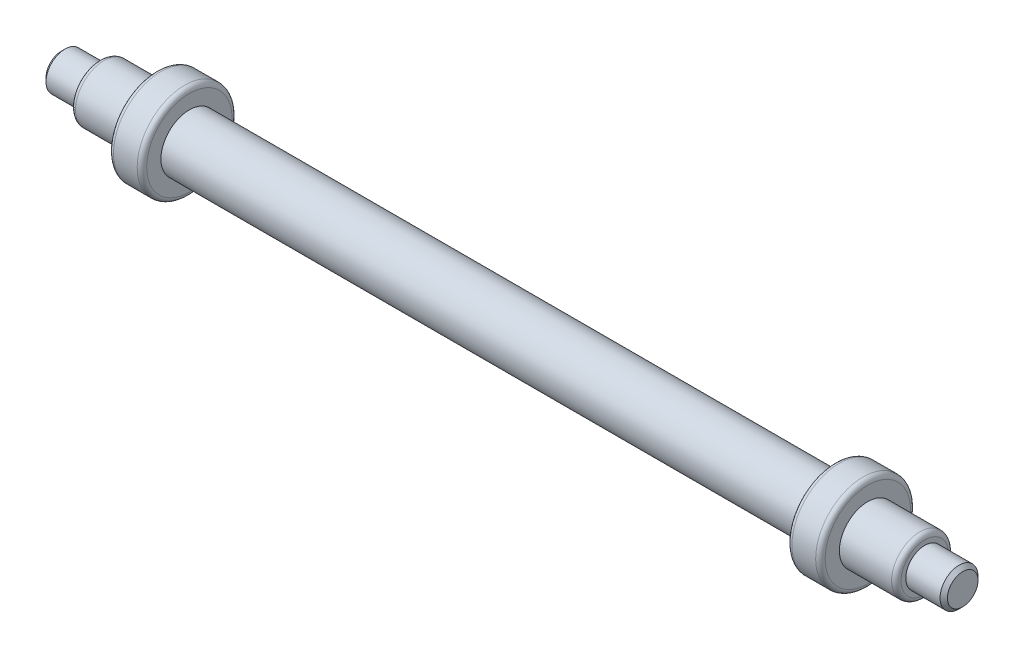
ISO-10303-21;
HEADER;
FILE_DESCRIPTION(('STEP AP214'),'2;1');
FILE_NAME('part.step','',(''),(''),'','','');
FILE_SCHEMA(('AUTOMOTIVE_DESIGN { 1 0 10303 214 1 1 1 1 }'));
ENDSEC;
DATA;
#1=APPLICATION_CONTEXT('core data for automotive mechanical design processes');
#2=APPLICATION_PROTOCOL_DEFINITION('international standard','automotive_design',2000,#1);
#3=PRODUCT_CONTEXT('',#1,'mechanical');
#4=PRODUCT('Part','Part','',(#3));
#5=PRODUCT_RELATED_PRODUCT_CATEGORY('part','',(#4));
#6=PRODUCT_DEFINITION_FORMATION('','',#4);
#7=PRODUCT_DEFINITION_CONTEXT('part definition',#1,'design');
#8=PRODUCT_DEFINITION('design','',#6,#7);
#9=PRODUCT_DEFINITION_SHAPE('','',#8);
#10=(LENGTH_UNIT() NAMED_UNIT(*) SI_UNIT(.MILLI.,.METRE.));
#11=(NAMED_UNIT(*) PLANE_ANGLE_UNIT() SI_UNIT($,.RADIAN.));
#12=(NAMED_UNIT(*) SI_UNIT($,.STERADIAN.) SOLID_ANGLE_UNIT());
#13=UNCERTAINTY_MEASURE_WITH_UNIT(LENGTH_MEASURE(1.E-05),#10,'distance_accuracy_value','');
#14=(GEOMETRIC_REPRESENTATION_CONTEXT(3) GLOBAL_UNCERTAINTY_ASSIGNED_CONTEXT((#13)) GLOBAL_UNIT_ASSIGNED_CONTEXT((#10,
#11,#12)) REPRESENTATION_CONTEXT('',''));
#15=CARTESIAN_POINT('',(0.,0.,0.));
#16=DIRECTION('',(0.,0.,1.));
#17=DIRECTION('',(1.,0.,0.));
#18=AXIS2_PLACEMENT_3D('',#15,#16,#17);
#19=CARTESIAN_POINT('',(-51.9877463821629,0.,0.));
#20=DIRECTION('',(-1.,0.,0.));
#21=DIRECTION('',(0.,0.,1.));
#22=AXIS2_PLACEMENT_3D('',#19,#20,#21);
#23=CYLINDRICAL_SURFACE('',#22,3.);
#24=CARTESIAN_POINT('',(37.5,0.,0.));
#25=DIRECTION('',(-1.,0.,0.));
#26=DIRECTION('',(0.,0.,1.));
#27=AXIS2_PLACEMENT_3D('',#24,#25,#26);
#28=CIRCLE('',#27,3.);
#29=CARTESIAN_POINT('',(37.5,0.,3.));
#30=VERTEX_POINT('',#29);
#31=EDGE_CURVE('E76',#30,#30,#28,.T.);
#32=ORIENTED_EDGE('',*,*,#31,.F.);
#33=EDGE_LOOP('',(#32));
#34=FACE_BOUND('',#33,.T.);
#35=CARTESIAN_POINT('',(34.,0.,0.));
#36=DIRECTION('',(-1.,0.,0.));
#37=DIRECTION('',(0.,0.,1.));
#38=AXIS2_PLACEMENT_3D('',#35,#36,#37);
#39=CIRCLE('',#38,3.);
#40=CARTESIAN_POINT('',(34.,0.,3.));
#41=VERTEX_POINT('',#40);
#42=EDGE_CURVE('E73',#41,#41,#39,.T.);
#43=ORIENTED_EDGE('',*,*,#42,.T.);
#44=EDGE_LOOP('',(#43));
#45=FACE_BOUND('',#44,.T.);
#46=ADVANCED_FACE('F53',(#34,#45),#23,.F.);
#47=CARTESIAN_POINT('',(34.,3.,0.));
#48=DIRECTION('',(1.,0.,0.));
#49=DIRECTION('',(0.,0.,-1.));
#50=AXIS2_PLACEMENT_3D('',#47,#48,#49);
#51=PLANE('',#50);
#52=CARTESIAN_POINT('',(34.,0.,0.));
#53=DIRECTION('',(1.,0.,0.));
#54=DIRECTION('',(0.,0.,-1.));
#55=AXIS2_PLACEMENT_3D('',#52,#53,#54);
#56=CIRCLE('',#55,4.5);
#57=CARTESIAN_POINT('',(34.,0.,-4.5));
#58=VERTEX_POINT('',#57);
#59=EDGE_CURVE('E68',#58,#58,#56,.F.);
#60=ORIENTED_EDGE('',*,*,#59,.T.);
#61=EDGE_LOOP('',(#60));
#62=FACE_BOUND('',#61,.T.);
#63=ORIENTED_EDGE('',*,*,#42,.F.);
#64=EDGE_LOOP('',(#63));
#65=FACE_BOUND('',#64,.T.);
#66=ADVANCED_FACE('F84',(#62,#65),#51,.F.);
#67=CARTESIAN_POINT('',(-51.9877463821629,0.,0.));
#68=DIRECTION('',(-1.,0.,0.));
#69=DIRECTION('',(0.,0.,1.));
#70=AXIS2_PLACEMENT_3D('',#67,#68,#69);
#71=CYLINDRICAL_SURFACE('',#70,4.99999999999999);
#72=CARTESIAN_POINT('',(34.5,0.,0.));
#73=DIRECTION('',(1.,0.,0.));
#74=DIRECTION('',(0.,0.,-1.));
#75=AXIS2_PLACEMENT_3D('',#72,#73,#74);
#76=CIRCLE('',#75,4.99999999999999);
#77=CARTESIAN_POINT('',(34.5,0.,-4.99999999999999));
#78=VERTEX_POINT('',#77);
#79=EDGE_CURVE('E60',#78,#78,#76,.T.);
#80=ORIENTED_EDGE('',*,*,#79,.T.);
#81=EDGE_LOOP('',(#80));
#82=FACE_BOUND('',#81,.T.);
#83=CARTESIAN_POINT('',(37.,0.,0.));
#84=DIRECTION('',(-1.,0.,0.));
#85=DIRECTION('',(0.,0.,1.));
#86=AXIS2_PLACEMENT_3D('',#83,#84,#85);
#87=CIRCLE('',#86,4.99999999999999);
#88=CARTESIAN_POINT('',(37.,0.,4.99999999999999));
#89=VERTEX_POINT('',#88);
#90=EDGE_CURVE('E64',#89,#89,#87,.T.);
#91=ORIENTED_EDGE('',*,*,#90,.T.);
#92=EDGE_LOOP('',(#91));
#93=FACE_BOUND('',#92,.T.);
#94=ADVANCED_FACE('F89',(#82,#93),#71,.T.);
#95=CARTESIAN_POINT('',(37.5,4.99999999999999,0.));
#96=DIRECTION('',(-1.,0.,0.));
#97=DIRECTION('',(0.,0.,1.));
#98=AXIS2_PLACEMENT_3D('',#95,#96,#97);
#99=PLANE('',#98);
#100=CARTESIAN_POINT('',(37.5,0.,0.));
#101=DIRECTION('',(-1.,0.,0.));
#102=DIRECTION('',(0.,0.,1.));
#103=AXIS2_PLACEMENT_3D('',#100,#101,#102);
#104=CIRCLE('',#103,4.5);
#105=CARTESIAN_POINT('',(37.5,0.,4.5));
#106=VERTEX_POINT('',#105);
#107=EDGE_CURVE('E11',#106,#106,#104,.F.);
#108=ORIENTED_EDGE('',*,*,#107,.T.);
#109=EDGE_LOOP('',(#108));
#110=FACE_BOUND('',#109,.T.);
#111=ORIENTED_EDGE('',*,*,#31,.T.);
#112=EDGE_LOOP('',(#111));
#113=FACE_BOUND('',#112,.T.);
#114=ADVANCED_FACE('F80',(#110,#113),#99,.F.);
#115=CARTESIAN_POINT('',(34.5,0.,0.));
#116=DIRECTION('',(1.,0.,0.));
#117=DIRECTION('',(0.,0.,-1.));
#118=AXIS2_PLACEMENT_3D('',#115,#116,#117);
#119=TOROIDAL_SURFACE('',#118,4.5,0.5);
#120=ORIENTED_EDGE('',*,*,#79,.F.);
#121=EDGE_LOOP('',(#120));
#122=FACE_BOUND('',#121,.T.);
#123=ORIENTED_EDGE('',*,*,#59,.F.);
#124=EDGE_LOOP('',(#123));
#125=FACE_BOUND('',#124,.T.);
#126=ADVANCED_FACE('F98',(#122,#125),#119,.T.);
#127=CARTESIAN_POINT('',(37.,0.,0.));
#128=DIRECTION('',(-1.,0.,0.));
#129=DIRECTION('',(0.,0.,1.));
#130=AXIS2_PLACEMENT_3D('',#127,#128,#129);
#131=TOROIDAL_SURFACE('',#130,4.5,0.5);
#132=ORIENTED_EDGE('',*,*,#107,.F.);
#133=EDGE_LOOP('',(#132));
#134=FACE_BOUND('',#133,.T.);
#135=ORIENTED_EDGE('',*,*,#90,.F.);
#136=EDGE_LOOP('',(#135));
#137=FACE_BOUND('',#136,.T.);
#138=ADVANCED_FACE('F55',(#134,#137),#131,.T.);
#139=CLOSED_SHELL('',(#46,#66,#94,#114,#126,#138));
#140=MANIFOLD_SOLID_BREP('B2',#139);
#141=CARTESIAN_POINT('',(-51.9877463821629,0.,0.));
#142=DIRECTION('',(-1.,0.,0.));
#143=DIRECTION('',(0.,0.,1.));
#144=AXIS2_PLACEMENT_3D('',#141,#142,#143);
#145=CYLINDRICAL_SURFACE('',#144,3.);
#146=CARTESIAN_POINT('',(-34.,0.,0.));
#147=DIRECTION('',(-1.,0.,0.));
#148=DIRECTION('',(0.,0.,1.));
#149=AXIS2_PLACEMENT_3D('',#146,#147,#148);
#150=CIRCLE('',#149,3.);
#151=CARTESIAN_POINT('',(-34.,0.,3.));
#152=VERTEX_POINT('',#151);
#153=EDGE_CURVE('E186',#152,#152,#150,.T.);
#154=ORIENTED_EDGE('',*,*,#153,.F.);
#155=EDGE_LOOP('',(#154));
#156=FACE_BOUND('',#155,.T.);
#157=CARTESIAN_POINT('',(-37.5,0.,0.));
#158=DIRECTION('',(-1.,0.,0.));
#159=DIRECTION('',(0.,0.,1.));
#160=AXIS2_PLACEMENT_3D('',#157,#158,#159);
#161=CIRCLE('',#160,3.);
#162=CARTESIAN_POINT('',(-37.5,0.,3.));
#163=VERTEX_POINT('',#162);
#164=EDGE_CURVE('E183',#163,#163,#161,.T.);
#165=ORIENTED_EDGE('',*,*,#164,.T.);
#166=EDGE_LOOP('',(#165));
#167=FACE_BOUND('',#166,.T.);
#168=ADVANCED_FACE('F163',(#156,#167),#145,.F.);
#169=CARTESIAN_POINT('',(-37.5,3.,0.));
#170=DIRECTION('',(1.,0.,0.));
#171=DIRECTION('',(0.,0.,-1.));
#172=AXIS2_PLACEMENT_3D('',#169,#170,#171);
#173=PLANE('',#172);
#174=CARTESIAN_POINT('',(-37.5,0.,0.));
#175=DIRECTION('',(1.,0.,0.));
#176=DIRECTION('',(0.,0.,-1.));
#177=AXIS2_PLACEMENT_3D('',#174,#175,#176);
#178=CIRCLE('',#177,4.5);
#179=CARTESIAN_POINT('',(-37.5,0.,-4.5));
#180=VERTEX_POINT('',#179);
#181=EDGE_CURVE('E178',#180,#180,#178,.F.);
#182=ORIENTED_EDGE('',*,*,#181,.T.);
#183=EDGE_LOOP('',(#182));
#184=FACE_BOUND('',#183,.T.);
#185=ORIENTED_EDGE('',*,*,#164,.F.);
#186=EDGE_LOOP('',(#185));
#187=FACE_BOUND('',#186,.T.);
#188=ADVANCED_FACE('F194',(#184,#187),#173,.F.);
#189=CARTESIAN_POINT('',(-51.9877463821629,0.,0.));
#190=DIRECTION('',(-1.,0.,0.));
#191=DIRECTION('',(0.,0.,1.));
#192=AXIS2_PLACEMENT_3D('',#189,#190,#191);
#193=CYLINDRICAL_SURFACE('',#192,4.99999999999999);
#194=CARTESIAN_POINT('',(-37.,0.,0.));
#195=DIRECTION('',(1.,0.,0.));
#196=DIRECTION('',(0.,0.,-1.));
#197=AXIS2_PLACEMENT_3D('',#194,#195,#196);
#198=CIRCLE('',#197,4.99999999999999);
#199=CARTESIAN_POINT('',(-37.,0.,-4.99999999999999));
#200=VERTEX_POINT('',#199);
#201=EDGE_CURVE('E170',#200,#200,#198,.T.);
#202=ORIENTED_EDGE('',*,*,#201,.T.);
#203=EDGE_LOOP('',(#202));
#204=FACE_BOUND('',#203,.T.);
#205=CARTESIAN_POINT('',(-34.5,0.,0.));
#206=DIRECTION('',(-1.,0.,0.));
#207=DIRECTION('',(0.,0.,1.));
#208=AXIS2_PLACEMENT_3D('',#205,#206,#207);
#209=CIRCLE('',#208,4.99999999999999);
#210=CARTESIAN_POINT('',(-34.5,0.,4.99999999999999));
#211=VERTEX_POINT('',#210);
#212=EDGE_CURVE('E174',#211,#211,#209,.T.);
#213=ORIENTED_EDGE('',*,*,#212,.T.);
#214=EDGE_LOOP('',(#213));
#215=FACE_BOUND('',#214,.T.);
#216=ADVANCED_FACE('F199',(#204,#215),#193,.T.);
#217=CARTESIAN_POINT('',(-34.,4.99999999999999,0.));
#218=DIRECTION('',(-1.,0.,0.));
#219=DIRECTION('',(0.,0.,1.));
#220=AXIS2_PLACEMENT_3D('',#217,#218,#219);
#221=PLANE('',#220);
#222=CARTESIAN_POINT('',(-34.,0.,0.));
#223=DIRECTION('',(-1.,0.,0.));
#224=DIRECTION('',(0.,0.,1.));
#225=AXIS2_PLACEMENT_3D('',#222,#223,#224);
#226=CIRCLE('',#225,4.5);
#227=CARTESIAN_POINT('',(-34.,0.,4.5));
#228=VERTEX_POINT('',#227);
#229=EDGE_CURVE('E52',#228,#228,#226,.F.);
#230=ORIENTED_EDGE('',*,*,#229,.T.);
#231=EDGE_LOOP('',(#230));
#232=FACE_BOUND('',#231,.T.);
#233=ORIENTED_EDGE('',*,*,#153,.T.);
#234=EDGE_LOOP('',(#233));
#235=FACE_BOUND('',#234,.T.);
#236=ADVANCED_FACE('F190',(#232,#235),#221,.F.);
#237=CARTESIAN_POINT('',(-37.,0.,0.));
#238=DIRECTION('',(1.,0.,0.));
#239=DIRECTION('',(0.,0.,-1.));
#240=AXIS2_PLACEMENT_3D('',#237,#238,#239);
#241=TOROIDAL_SURFACE('',#240,4.5,0.5);
#242=ORIENTED_EDGE('',*,*,#201,.F.);
#243=EDGE_LOOP('',(#242));
#244=FACE_BOUND('',#243,.T.);
#245=ORIENTED_EDGE('',*,*,#181,.F.);
#246=EDGE_LOOP('',(#245));
#247=FACE_BOUND('',#246,.T.);
#248=ADVANCED_FACE('F208',(#244,#247),#241,.T.);
#249=CARTESIAN_POINT('',(-34.5,0.,0.));
#250=DIRECTION('',(-1.,0.,0.));
#251=DIRECTION('',(0.,0.,1.));
#252=AXIS2_PLACEMENT_3D('',#249,#250,#251);
#253=TOROIDAL_SURFACE('',#252,4.5,0.5);
#254=ORIENTED_EDGE('',*,*,#229,.F.);
#255=EDGE_LOOP('',(#254));
#256=FACE_BOUND('',#255,.T.);
#257=ORIENTED_EDGE('',*,*,#212,.F.);
#258=EDGE_LOOP('',(#257));
#259=FACE_BOUND('',#258,.T.);
#260=ADVANCED_FACE('F165',(#256,#259),#253,.T.);
#261=CLOSED_SHELL('',(#168,#188,#216,#236,#248,#260));
#262=MANIFOLD_SOLID_BREP('B6',#261);
#263=CARTESIAN_POINT('',(-51.9877463821629,0.,0.));
#264=DIRECTION('',(-1.,0.,0.));
#265=DIRECTION('',(0.,0.,1.));
#266=AXIS2_PLACEMENT_3D('',#263,#264,#265);
#267=CYLINDRICAL_SURFACE('',#266,2.);
#268=CARTESIAN_POINT('',(47.11,0.,0.));
#269=DIRECTION('',(-1.,0.,0.));
#270=DIRECTION('',(0.,0.,1.));
#271=AXIS2_PLACEMENT_3D('',#268,#269,#270);
#272=CIRCLE('',#271,2.);
#273=CARTESIAN_POINT('',(47.11,0.,2.));
#274=VERTEX_POINT('',#273);
#275=EDGE_CURVE('E298',#274,#274,#272,.T.);
#276=ORIENTED_EDGE('',*,*,#275,.T.);
#277=EDGE_LOOP('',(#276));
#278=FACE_BOUND('',#277,.T.);
#279=CARTESIAN_POINT('',(43.5,0.,0.));
#280=DIRECTION('',(-1.,0.,0.));
#281=DIRECTION('',(0.,0.,1.));
#282=AXIS2_PLACEMENT_3D('',#279,#280,#281);
#283=CIRCLE('',#282,2.);
#284=CARTESIAN_POINT('',(43.5,0.,2.));
#285=VERTEX_POINT('',#284);
#286=EDGE_CURVE('E290',#285,#285,#283,.T.);
#287=ORIENTED_EDGE('',*,*,#286,.F.);
#288=EDGE_LOOP('',(#287));
#289=FACE_BOUND('',#288,.T.);
#290=ADVANCED_FACE('F266',(#278,#289),#267,.T.);
#291=CARTESIAN_POINT('',(43.5,2.,0.));
#292=DIRECTION('',(-1.,0.,0.));
#293=DIRECTION('',(0.,0.,1.));
#294=AXIS2_PLACEMENT_3D('',#291,#292,#293);
#295=PLANE('',#294);
#296=CARTESIAN_POINT('',(43.5,0.,0.));
#297=DIRECTION('',(-1.,0.,0.));
#298=DIRECTION('',(0.,0.,1.));
#299=AXIS2_PLACEMENT_3D('',#296,#297,#298);
#300=CIRCLE('',#299,2.5);
#301=CARTESIAN_POINT('',(43.5,0.,2.5));
#302=VERTEX_POINT('',#301);
#303=EDGE_CURVE('E274',#302,#302,#300,.F.);
#304=ORIENTED_EDGE('',*,*,#303,.T.);
#305=EDGE_LOOP('',(#304));
#306=FACE_BOUND('',#305,.T.);
#307=ORIENTED_EDGE('',*,*,#286,.T.);
#308=EDGE_LOOP('',(#307));
#309=FACE_BOUND('',#308,.T.);
#310=ADVANCED_FACE('F334',(#306,#309),#295,.F.);
#311=CARTESIAN_POINT('',(-51.9877463821629,0.,0.));
#312=DIRECTION('',(-1.,0.,0.));
#313=DIRECTION('',(0.,0.,1.));
#314=AXIS2_PLACEMENT_3D('',#311,#312,#313);
#315=CYLINDRICAL_SURFACE('',#314,3.);
#316=CARTESIAN_POINT('',(43.,0.,0.));
#317=DIRECTION('',(-1.,0.,0.));
#318=DIRECTION('',(0.,0.,1.));
#319=AXIS2_PLACEMENT_3D('',#316,#317,#318);
#320=CIRCLE('',#319,3.);
#321=CARTESIAN_POINT('',(43.,0.,3.));
#322=VERTEX_POINT('',#321);
#323=EDGE_CURVE('E279',#322,#322,#320,.T.);
#324=ORIENTED_EDGE('',*,*,#323,.T.);
#325=EDGE_LOOP('',(#324));
#326=FACE_BOUND('',#325,.T.);
#327=CARTESIAN_POINT('',(-43.,0.,0.));
#328=DIRECTION('',(1.,0.,0.));
#329=DIRECTION('',(0.,0.,-1.));
#330=AXIS2_PLACEMENT_3D('',#327,#328,#329);
#331=CIRCLE('',#330,3.);
#332=CARTESIAN_POINT('',(-43.,0.,-3.));
#333=VERTEX_POINT('',#332);
#334=EDGE_CURVE('E284',#333,#333,#331,.T.);
#335=ORIENTED_EDGE('',*,*,#334,.T.);
#336=EDGE_LOOP('',(#335));
#337=FACE_BOUND('',#336,.T.);
#338=ADVANCED_FACE('F341',(#326,#337),#315,.T.);
#339=CARTESIAN_POINT('',(-43.5,3.,0.));
#340=DIRECTION('',(1.,0.,0.));
#341=DIRECTION('',(0.,0.,-1.));
#342=AXIS2_PLACEMENT_3D('',#339,#340,#341);
#343=PLANE('',#342);
#344=CARTESIAN_POINT('',(-43.5,0.,0.));
#345=DIRECTION('',(1.,0.,0.));
#346=DIRECTION('',(0.,0.,-1.));
#347=AXIS2_PLACEMENT_3D('',#344,#345,#346);
#348=CIRCLE('',#347,2.5);
#349=CARTESIAN_POINT('',(-43.5,0.,-2.5));
#350=VERTEX_POINT('',#349);
#351=EDGE_CURVE('E162',#350,#350,#348,.F.);
#352=ORIENTED_EDGE('',*,*,#351,.T.);
#353=EDGE_LOOP('',(#352));
#354=FACE_BOUND('',#353,.T.);
#355=CARTESIAN_POINT('',(-43.5,0.,0.));
#356=DIRECTION('',(-1.,0.,0.));
#357=DIRECTION('',(0.,0.,1.));
#358=AXIS2_PLACEMENT_3D('',#355,#356,#357);
#359=CIRCLE('',#358,2.);
#360=CARTESIAN_POINT('',(-43.5,0.,2.));
#361=VERTEX_POINT('',#360);
#362=EDGE_CURVE('E294',#361,#361,#359,.T.);
#363=ORIENTED_EDGE('',*,*,#362,.F.);
#364=EDGE_LOOP('',(#363));
#365=FACE_BOUND('',#364,.T.);
#366=ADVANCED_FACE('F361',(#354,#365),#343,.F.);
#367=CARTESIAN_POINT('',(-51.9877463821629,0.,0.));
#368=DIRECTION('',(-1.,0.,0.));
#369=DIRECTION('',(0.,0.,1.));
#370=AXIS2_PLACEMENT_3D('',#367,#368,#369);
#371=CYLINDRICAL_SURFACE('',#370,2.);
#372=CARTESIAN_POINT('',(-47.11,0.,0.));
#373=DIRECTION('',(1.,0.,0.));
#374=DIRECTION('',(0.,0.,-1.));
#375=AXIS2_PLACEMENT_3D('',#372,#373,#374);
#376=CIRCLE('',#375,2.);
#377=CARTESIAN_POINT('',(-47.11,0.,-2.));
#378=VERTEX_POINT('',#377);
#379=EDGE_CURVE('E306',#378,#378,#376,.T.);
#380=ORIENTED_EDGE('',*,*,#379,.T.);
#381=EDGE_LOOP('',(#380));
#382=FACE_BOUND('',#381,.T.);
#383=ORIENTED_EDGE('',*,*,#362,.T.);
#384=EDGE_LOOP('',(#383));
#385=FACE_BOUND('',#384,.T.);
#386=ADVANCED_FACE('F354',(#382,#385),#371,.T.);
#387=CARTESIAN_POINT('',(47.5,0.,0.));
#388=DIRECTION('',(-1.,0.,0.));
#389=DIRECTION('',(0.,0.,1.));
#390=AXIS2_PLACEMENT_3D('',#387,#388,#389);
#391=CONICAL_SURFACE('',#390,1.61,0.785398163397449);
#392=ORIENTED_EDGE('',*,*,#275,.F.);
#393=EDGE_LOOP('',(#392));
#394=FACE_BOUND('',#393,.T.);
#395=CARTESIAN_POINT('',(47.5,0.,0.));
#396=DIRECTION('',(-1.,0.,0.));
#397=DIRECTION('',(0.,0.,1.));
#398=AXIS2_PLACEMENT_3D('',#395,#396,#397);
#399=CIRCLE('',#398,1.61);
#400=CARTESIAN_POINT('',(47.5,0.,1.61));
#401=VERTEX_POINT('',#400);
#402=EDGE_CURVE('E302',#401,#401,#399,.T.);
#403=ORIENTED_EDGE('',*,*,#402,.T.);
#404=EDGE_LOOP('',(#403));
#405=FACE_BOUND('',#404,.T.);
#406=ADVANCED_FACE('F347',(#394,#405),#391,.T.);
#407=CARTESIAN_POINT('',(47.5,0.,0.));
#408=DIRECTION('',(-1.,0.,0.));
#409=DIRECTION('',(0.,0.,1.));
#410=AXIS2_PLACEMENT_3D('',#407,#408,#409);
#411=PLANE('',#410);
#412=ORIENTED_EDGE('',*,*,#402,.F.);
#413=EDGE_LOOP('',(#412));
#414=FACE_BOUND('',#413,.T.);
#415=ADVANCED_FACE('F328',(#414),#411,.F.);
#416=CARTESIAN_POINT('',(-47.5,0.,0.));
#417=DIRECTION('',(1.,0.,0.));
#418=DIRECTION('',(0.,0.,-1.));
#419=AXIS2_PLACEMENT_3D('',#416,#417,#418);
#420=CONICAL_SURFACE('',#419,1.61,0.785398163397466);
#421=ORIENTED_EDGE('',*,*,#379,.F.);
#422=EDGE_LOOP('',(#421));
#423=FACE_BOUND('',#422,.T.);
#424=CARTESIAN_POINT('',(-47.5,0.,0.));
#425=DIRECTION('',(1.,0.,0.));
#426=DIRECTION('',(0.,0.,-1.));
#427=AXIS2_PLACEMENT_3D('',#424,#425,#426);
#428=CIRCLE('',#427,1.61);
#429=CARTESIAN_POINT('',(-47.5,0.,-1.61));
#430=VERTEX_POINT('',#429);
#431=EDGE_CURVE('E310',#430,#430,#428,.T.);
#432=ORIENTED_EDGE('',*,*,#431,.T.);
#433=EDGE_LOOP('',(#432));
#434=FACE_BOUND('',#433,.T.);
#435=ADVANCED_FACE('F315',(#423,#434),#420,.T.);
#436=CARTESIAN_POINT('',(-47.5,2.,0.));
#437=DIRECTION('',(1.,0.,0.));
#438=DIRECTION('',(0.,0.,-1.));
#439=AXIS2_PLACEMENT_3D('',#436,#437,#438);
#440=PLANE('',#439);
#441=ORIENTED_EDGE('',*,*,#431,.F.);
#442=EDGE_LOOP('',(#441));
#443=FACE_BOUND('',#442,.T.);
#444=ADVANCED_FACE('F317',(#443),#440,.F.);
#445=CARTESIAN_POINT('',(43.,0.,0.));
#446=DIRECTION('',(-1.,0.,0.));
#447=DIRECTION('',(0.,0.,1.));
#448=AXIS2_PLACEMENT_3D('',#445,#446,#447);
#449=TOROIDAL_SURFACE('',#448,2.5,0.5);
#450=ORIENTED_EDGE('',*,*,#303,.F.);
#451=EDGE_LOOP('',(#450));
#452=FACE_BOUND('',#451,.T.);
#453=ORIENTED_EDGE('',*,*,#323,.F.);
#454=EDGE_LOOP('',(#453));
#455=FACE_BOUND('',#454,.T.);
#456=ADVANCED_FACE('F319',(#452,#455),#449,.T.);
#457=CARTESIAN_POINT('',(-43.,0.,0.));
#458=DIRECTION('',(1.,0.,0.));
#459=DIRECTION('',(0.,0.,-1.));
#460=AXIS2_PLACEMENT_3D('',#457,#458,#459);
#461=TOROIDAL_SURFACE('',#460,2.5,0.5);
#462=ORIENTED_EDGE('',*,*,#334,.F.);
#463=EDGE_LOOP('',(#462));
#464=FACE_BOUND('',#463,.T.);
#465=ORIENTED_EDGE('',*,*,#351,.F.);
#466=EDGE_LOOP('',(#465));
#467=FACE_BOUND('',#466,.T.);
#468=ADVANCED_FACE('F268',(#464,#467),#461,.T.);
#469=CLOSED_SHELL('',(#290,#310,#338,#366,#386,#406,#415,#435,#444,#456,#468));
#470=MANIFOLD_SOLID_BREP('B47',#469);
#471=ADVANCED_BREP_SHAPE_REPRESENTATION('',(#18,#140,#262,#470),#14);
#472=SHAPE_DEFINITION_REPRESENTATION(#9,#471);
ENDSEC;
END-ISO-10303-21;
